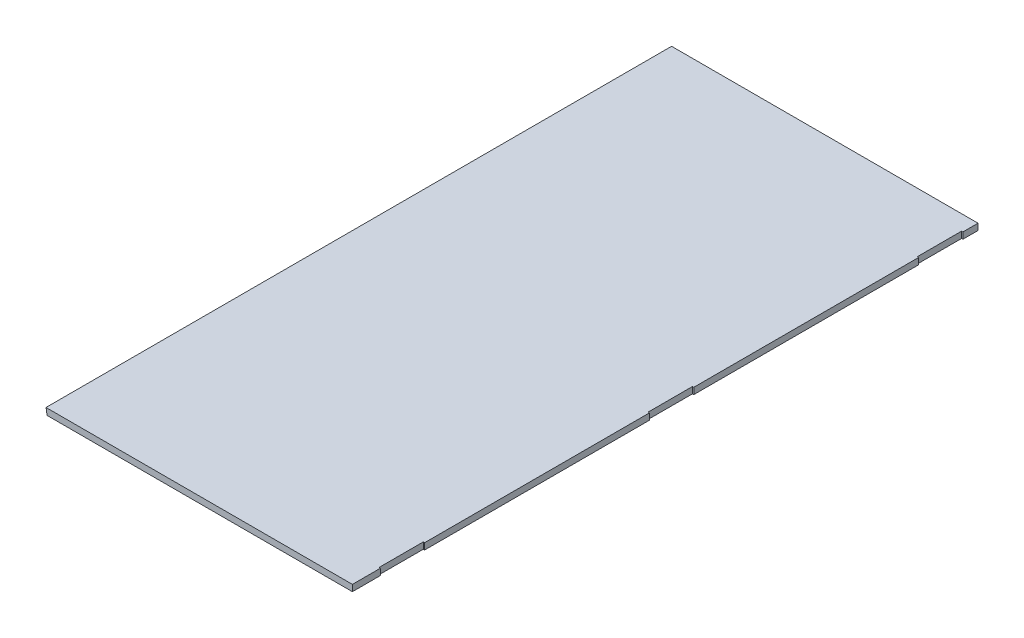
ISO-10303-21;
HEADER;
FILE_DESCRIPTION(('STEP AP214'),'2;1');
FILE_NAME('part.step','',(''),(''),'','','');
FILE_SCHEMA(('AUTOMOTIVE_DESIGN { 1 0 10303 214 1 1 1 1 }'));
ENDSEC;
DATA;
#1=APPLICATION_CONTEXT('core data for automotive mechanical design processes');
#2=APPLICATION_PROTOCOL_DEFINITION('international standard','automotive_design',2000,#1);
#3=PRODUCT_CONTEXT('',#1,'mechanical');
#4=PRODUCT('Part','Part','',(#3));
#5=PRODUCT_RELATED_PRODUCT_CATEGORY('part','',(#4));
#6=PRODUCT_DEFINITION_FORMATION('','',#4);
#7=PRODUCT_DEFINITION_CONTEXT('part definition',#1,'design');
#8=PRODUCT_DEFINITION('design','',#6,#7);
#9=PRODUCT_DEFINITION_SHAPE('','',#8);
#10=(LENGTH_UNIT() NAMED_UNIT(*) SI_UNIT(.MILLI.,.METRE.));
#11=(NAMED_UNIT(*) PLANE_ANGLE_UNIT() SI_UNIT($,.RADIAN.));
#12=(NAMED_UNIT(*) SI_UNIT($,.STERADIAN.) SOLID_ANGLE_UNIT());
#13=UNCERTAINTY_MEASURE_WITH_UNIT(LENGTH_MEASURE(1.E-05),#10,'distance_accuracy_value','');
#14=(GEOMETRIC_REPRESENTATION_CONTEXT(3) GLOBAL_UNCERTAINTY_ASSIGNED_CONTEXT((#13)) GLOBAL_UNIT_ASSIGNED_CONTEXT((#10,
#11,#12)) REPRESENTATION_CONTEXT('',''));
#15=CARTESIAN_POINT('',(0.,0.,0.));
#16=DIRECTION('',(0.,0.,1.));
#17=DIRECTION('',(1.,0.,0.));
#18=AXIS2_PLACEMENT_3D('',#15,#16,#17);
#19=CARTESIAN_POINT('',(438.912,18.25625,896.112));
#20=DIRECTION('',(-1.,0.,0.));
#21=DIRECTION('',(0.,0.,1.));
#22=AXIS2_PLACEMENT_3D('',#19,#20,#21);
#23=PLANE('',#22);
#24=DIRECTION('',(0.,0.,-1.));
#25=VECTOR('',#24,1.);
#26=CARTESIAN_POINT('',(438.912,18.25625,896.112));
#27=LINE('',#26,#25);
#28=CARTESIAN_POINT('',(438.912,18.25625,689.356));
#29=VERTEX_POINT('',#28);
#30=CARTESIAN_POINT('',(438.912,18.25625,45.212));
#31=VERTEX_POINT('',#30);
#32=EDGE_CURVE('E256',#29,#31,#27,.T.);
#33=ORIENTED_EDGE('',*,*,#32,.F.);
#34=DIRECTION('',(0.,1.,0.));
#35=VECTOR('',#34,1.);
#36=CARTESIAN_POINT('',(438.912,0.,689.356));
#37=LINE('',#36,#35);
#38=CARTESIAN_POINT('',(438.912,0.,689.356));
#39=VERTEX_POINT('',#38);
#40=EDGE_CURVE('E210',#39,#29,#37,.T.);
#41=ORIENTED_EDGE('',*,*,#40,.F.);
#42=DIRECTION('',(0.,0.,-1.));
#43=VECTOR('',#42,1.);
#44=CARTESIAN_POINT('',(438.912,0.,896.112));
#45=LINE('',#44,#43);
#46=CARTESIAN_POINT('',(438.912,0.,45.212));
#47=VERTEX_POINT('',#46);
#48=EDGE_CURVE('E195',#39,#47,#45,.T.);
#49=ORIENTED_EDGE('',*,*,#48,.T.);
#50=DIRECTION('',(0.,-1.,0.));
#51=VECTOR('',#50,1.);
#52=CARTESIAN_POINT('',(438.912,18.25625,45.212));
#53=LINE('',#52,#51);
#54=EDGE_CURVE('E208',#31,#47,#53,.T.);
#55=ORIENTED_EDGE('',*,*,#54,.F.);
#56=EDGE_LOOP('',(#33,#41,#49,#55));
#57=FACE_BOUND('',#56,.T.);
#58=ADVANCED_FACE('F38',(#57),#23,.F.);
#59=CARTESIAN_POINT('',(438.912,0.,896.112));
#60=VERTEX_POINT('',#59);
#61=CARTESIAN_POINT('',(438.912,0.,816.356));
#62=VERTEX_POINT('',#61);
#63=EDGE_CURVE('E167',#60,#62,#45,.T.);
#64=ORIENTED_EDGE('',*,*,#63,.T.);
#65=DIRECTION('',(0.,-1.,0.));
#66=VECTOR('',#65,1.);
#67=CARTESIAN_POINT('',(438.912,18.25625,816.356));
#68=LINE('',#67,#66);
#69=CARTESIAN_POINT('',(438.912,18.25625,816.356));
#70=VERTEX_POINT('',#69);
#71=EDGE_CURVE('E265',#70,#62,#68,.T.);
#72=ORIENTED_EDGE('',*,*,#71,.F.);
#73=CARTESIAN_POINT('',(438.912,18.25625,896.112));
#74=VERTEX_POINT('',#73);
#75=EDGE_CURVE('E173',#74,#70,#27,.T.);
#76=ORIENTED_EDGE('',*,*,#75,.F.);
#77=DIRECTION('',(0.,-1.,0.));
#78=VECTOR('',#77,1.);
#79=CARTESIAN_POINT('',(438.912,18.25625,896.112));
#80=LINE('',#79,#78);
#81=EDGE_CURVE('E177',#74,#60,#80,.T.);
#82=ORIENTED_EDGE('',*,*,#81,.T.);
#83=EDGE_LOOP('',(#64,#72,#76,#82));
#84=FACE_BOUND('',#83,.T.);
#85=ADVANCED_FACE('F264',(#84),#23,.F.);
#86=CARTESIAN_POINT('',(438.912,18.2562499999998,-81.788));
#87=VERTEX_POINT('',#86);
#88=CARTESIAN_POINT('',(438.912,18.25625,-725.932));
#89=VERTEX_POINT('',#88);
#90=EDGE_CURVE('E171',#87,#89,#27,.T.);
#91=ORIENTED_EDGE('',*,*,#90,.F.);
#92=DIRECTION('',(0.,1.,0.));
#93=VECTOR('',#92,1.);
#94=CARTESIAN_POINT('',(438.912,0.,-81.788));
#95=LINE('',#94,#93);
#96=CARTESIAN_POINT('',(438.912,0.,-81.788));
#97=VERTEX_POINT('',#96);
#98=EDGE_CURVE('E283',#97,#87,#95,.T.);
#99=ORIENTED_EDGE('',*,*,#98,.F.);
#100=CARTESIAN_POINT('',(438.912,0.,-725.932));
#101=VERTEX_POINT('',#100);
#102=EDGE_CURVE('E192',#97,#101,#45,.T.);
#103=ORIENTED_EDGE('',*,*,#102,.T.);
#104=DIRECTION('',(0.,-1.,0.));
#105=VECTOR('',#104,1.);
#106=CARTESIAN_POINT('',(438.912,18.25625,-725.932));
#107=LINE('',#106,#105);
#108=EDGE_CURVE('E243',#89,#101,#107,.T.);
#109=ORIENTED_EDGE('',*,*,#108,.F.);
#110=EDGE_LOOP('',(#91,#99,#103,#109));
#111=FACE_BOUND('',#110,.T.);
#112=ADVANCED_FACE('F298',(#111),#23,.F.);
#113=CARTESIAN_POINT('',(438.912,18.25625,-852.932));
#114=VERTEX_POINT('',#113);
#115=CARTESIAN_POINT('',(438.912,18.25625,-896.112));
#116=VERTEX_POINT('',#115);
#117=EDGE_CURVE('E168',#114,#116,#27,.T.);
#118=ORIENTED_EDGE('',*,*,#117,.F.);
#119=DIRECTION('',(0.,1.,0.));
#120=VECTOR('',#119,1.);
#121=CARTESIAN_POINT('',(438.912,0.,-852.932));
#122=LINE('',#121,#120);
#123=CARTESIAN_POINT('',(438.912,0.,-852.932));
#124=VERTEX_POINT('',#123);
#125=EDGE_CURVE('E190',#124,#114,#122,.T.);
#126=ORIENTED_EDGE('',*,*,#125,.F.);
#127=CARTESIAN_POINT('',(438.912,0.,-896.112));
#128=VERTEX_POINT('',#127);
#129=EDGE_CURVE('E189',#124,#128,#45,.T.);
#130=ORIENTED_EDGE('',*,*,#129,.T.);
#131=DIRECTION('',(0.,-1.,0.));
#132=VECTOR('',#131,1.);
#133=CARTESIAN_POINT('',(438.912,18.25625,-896.112));
#134=LINE('',#133,#132);
#135=EDGE_CURVE('E46',#116,#128,#134,.T.);
#136=ORIENTED_EDGE('',*,*,#135,.F.);
#137=EDGE_LOOP('',(#118,#126,#130,#136));
#138=FACE_BOUND('',#137,.T.);
#139=ADVANCED_FACE('F40',(#138),#23,.F.);
#140=CARTESIAN_POINT('',(-438.912,18.25625,-896.112));
#141=DIRECTION('',(0.,0.,1.));
#142=DIRECTION('',(1.,0.,0.));
#143=AXIS2_PLACEMENT_3D('',#140,#141,#142);
#144=PLANE('',#143);
#145=DIRECTION('',(-1.,0.,0.));
#146=VECTOR('',#145,1.);
#147=CARTESIAN_POINT('',(-438.912,0.,-896.112));
#148=LINE('',#147,#146);
#149=CARTESIAN_POINT('',(-435.692930558441,0.,-896.112));
#150=VERTEX_POINT('',#149);
#151=EDGE_CURVE('E169',#128,#150,#148,.T.);
#152=ORIENTED_EDGE('',*,*,#151,.T.);
#153=DIRECTION('',(-0.173648177666931,0.984807753012208,0.));
#154=VECTOR('',#153,1.);
#155=CARTESIAN_POINT('',(-438.912,18.25625,-896.112));
#156=LINE('',#155,#154);
#157=CARTESIAN_POINT('',(-438.912,18.25625,-896.112));
#158=VERTEX_POINT('',#157);
#159=EDGE_CURVE('E52',#150,#158,#156,.T.);
#160=ORIENTED_EDGE('',*,*,#159,.T.);
#161=DIRECTION('',(-1.,0.,0.));
#162=VECTOR('',#161,1.);
#163=CARTESIAN_POINT('',(-438.912,18.25625,-896.112));
#164=LINE('',#163,#162);
#165=EDGE_CURVE('E184',#116,#158,#164,.T.);
#166=ORIENTED_EDGE('',*,*,#165,.F.);
#167=ORIENTED_EDGE('',*,*,#135,.T.);
#168=EDGE_LOOP('',(#152,#160,#166,#167));
#169=FACE_BOUND('',#168,.T.);
#170=ADVANCED_FACE('F182',(#169),#144,.F.);
#171=CARTESIAN_POINT('',(-438.912,18.25625,896.112));
#172=DIRECTION('',(0.,0.,-1.));
#173=DIRECTION('',(-1.,0.,0.));
#174=AXIS2_PLACEMENT_3D('',#171,#172,#173);
#175=PLANE('',#174);
#176=DIRECTION('',(1.,0.,0.));
#177=VECTOR('',#176,1.);
#178=CARTESIAN_POINT('',(-438.912,18.25625,896.112));
#179=LINE('',#178,#177);
#180=CARTESIAN_POINT('',(-438.912,18.25625,896.112));
#181=VERTEX_POINT('',#180);
#182=EDGE_CURVE('E161',#181,#74,#179,.T.);
#183=ORIENTED_EDGE('',*,*,#182,.F.);
#184=DIRECTION('',(-0.173648177666931,0.984807753012208,0.));
#185=VECTOR('',#184,1.);
#186=CARTESIAN_POINT('',(-438.912,18.25625,896.112));
#187=LINE('',#186,#185);
#188=CARTESIAN_POINT('',(-435.692930558441,0.,896.112));
#189=VERTEX_POINT('',#188);
#190=EDGE_CURVE('E149',#189,#181,#187,.T.);
#191=ORIENTED_EDGE('',*,*,#190,.F.);
#192=DIRECTION('',(1.,0.,0.));
#193=VECTOR('',#192,1.);
#194=CARTESIAN_POINT('',(-438.912,0.,896.112));
#195=LINE('',#194,#193);
#196=EDGE_CURVE('E159',#189,#60,#195,.T.);
#197=ORIENTED_EDGE('',*,*,#196,.T.);
#198=ORIENTED_EDGE('',*,*,#81,.F.);
#199=EDGE_LOOP('',(#183,#191,#197,#198));
#200=FACE_BOUND('',#199,.T.);
#201=ADVANCED_FACE('F157',(#200),#175,.F.);
#202=CARTESIAN_POINT('',(0.,18.25625,0.));
#203=DIRECTION('',(0.,-1.,0.));
#204=DIRECTION('',(0.,0.,-1.));
#205=AXIS2_PLACEMENT_3D('',#202,#203,#204);
#206=PLANE('',#205);
#207=DIRECTION('',(0.,0.,1.));
#208=VECTOR('',#207,1.);
#209=CARTESIAN_POINT('',(435.102,18.25625,689.356));
#210=LINE('',#209,#208);
#211=CARTESIAN_POINT('',(435.102,18.25625,689.356));
#212=VERTEX_POINT('',#211);
#213=CARTESIAN_POINT('',(435.102,18.25625,816.356));
#214=VERTEX_POINT('',#213);
#215=EDGE_CURVE('E269',#212,#214,#210,.T.);
#216=ORIENTED_EDGE('',*,*,#215,.F.);
#217=DIRECTION('',(1.,0.,0.));
#218=VECTOR('',#217,1.);
#219=CARTESIAN_POINT('',(435.102,18.25625,689.356));
#220=LINE('',#219,#218);
#221=EDGE_CURVE('E193',#212,#29,#220,.T.);
#222=ORIENTED_EDGE('',*,*,#221,.T.);
#223=ORIENTED_EDGE('',*,*,#32,.T.);
#224=DIRECTION('',(1.,0.,0.));
#225=VECTOR('',#224,1.);
#226=CARTESIAN_POINT('',(435.102,18.25625,45.212));
#227=LINE('',#226,#225);
#228=CARTESIAN_POINT('',(435.102,18.25625,45.212));
#229=VERTEX_POINT('',#228);
#230=EDGE_CURVE('E267',#229,#31,#227,.T.);
#231=ORIENTED_EDGE('',*,*,#230,.F.);
#232=DIRECTION('',(0.,0.,1.));
#233=VECTOR('',#232,1.);
#234=CARTESIAN_POINT('',(435.102,18.2562499999998,-81.788));
#235=LINE('',#234,#233);
#236=CARTESIAN_POINT('',(435.102,18.2562499999998,-81.788));
#237=VERTEX_POINT('',#236);
#238=EDGE_CURVE('E222',#237,#229,#235,.T.);
#239=ORIENTED_EDGE('',*,*,#238,.F.);
#240=DIRECTION('',(1.,0.,0.));
#241=VECTOR('',#240,1.);
#242=CARTESIAN_POINT('',(435.102,18.2562499999998,-81.788));
#243=LINE('',#242,#241);
#244=EDGE_CURVE('E224',#237,#87,#243,.T.);
#245=ORIENTED_EDGE('',*,*,#244,.T.);
#246=ORIENTED_EDGE('',*,*,#90,.T.);
#247=DIRECTION('',(1.,0.,0.));
#248=VECTOR('',#247,1.);
#249=CARTESIAN_POINT('',(435.102,18.25625,-725.932));
#250=LINE('',#249,#248);
#251=CARTESIAN_POINT('',(435.102,18.25625,-725.932));
#252=VERTEX_POINT('',#251);
#253=EDGE_CURVE('E246',#252,#89,#250,.T.);
#254=ORIENTED_EDGE('',*,*,#253,.F.);
#255=DIRECTION('',(0.,0.,1.));
#256=VECTOR('',#255,1.);
#257=CARTESIAN_POINT('',(435.102,18.25625,-852.932));
#258=LINE('',#257,#256);
#259=CARTESIAN_POINT('',(435.102,18.25625,-852.932));
#260=VERTEX_POINT('',#259);
#261=EDGE_CURVE('E239',#260,#252,#258,.T.);
#262=ORIENTED_EDGE('',*,*,#261,.F.);
#263=DIRECTION('',(1.,0.,0.));
#264=VECTOR('',#263,1.);
#265=CARTESIAN_POINT('',(435.102,18.25625,-852.932));
#266=LINE('',#265,#264);
#267=EDGE_CURVE('E248',#260,#114,#266,.T.);
#268=ORIENTED_EDGE('',*,*,#267,.T.);
#269=ORIENTED_EDGE('',*,*,#117,.T.);
#270=ORIENTED_EDGE('',*,*,#165,.T.);
#271=DIRECTION('',(0.,0.,1.));
#272=VECTOR('',#271,1.);
#273=CARTESIAN_POINT('',(-438.912,18.25625,896.112));
#274=LINE('',#273,#272);
#275=EDGE_CURVE('E258',#158,#181,#274,.T.);
#276=ORIENTED_EDGE('',*,*,#275,.T.);
#277=ORIENTED_EDGE('',*,*,#182,.T.);
#278=ORIENTED_EDGE('',*,*,#75,.T.);
#279=DIRECTION('',(1.,0.,0.));
#280=VECTOR('',#279,1.);
#281=CARTESIAN_POINT('',(435.102,18.25625,816.356));
#282=LINE('',#281,#280);
#283=EDGE_CURVE('E279',#214,#70,#282,.T.);
#284=ORIENTED_EDGE('',*,*,#283,.F.);
#285=EDGE_LOOP('',(#216,#222,#223,#231,#239,#245,#246,#254,#262,#268,#269,#270,#276,#277,#278,#284));
#286=FACE_BOUND('',#285,.T.);
#287=ADVANCED_FACE('F261',(#286),#206,.F.);
#288=CARTESIAN_POINT('',(0.,0.,0.));
#289=DIRECTION('',(0.,-1.,0.));
#290=DIRECTION('',(0.,0.,-1.));
#291=AXIS2_PLACEMENT_3D('',#288,#289,#290);
#292=PLANE('',#291);
#293=DIRECTION('',(0.,0.,1.));
#294=VECTOR('',#293,1.);
#295=CARTESIAN_POINT('',(-435.692930558441,0.,0.));
#296=LINE('',#295,#294);
#297=EDGE_CURVE('E11',#150,#189,#296,.T.);
#298=ORIENTED_EDGE('',*,*,#297,.F.);
#299=ORIENTED_EDGE('',*,*,#151,.F.);
#300=ORIENTED_EDGE('',*,*,#129,.F.);
#301=DIRECTION('',(1.,0.,0.));
#302=VECTOR('',#301,1.);
#303=CARTESIAN_POINT('',(435.102,0.,-852.932));
#304=LINE('',#303,#302);
#305=CARTESIAN_POINT('',(435.102,0.,-852.932));
#306=VERTEX_POINT('',#305);
#307=EDGE_CURVE('E251',#306,#124,#304,.T.);
#308=ORIENTED_EDGE('',*,*,#307,.F.);
#309=DIRECTION('',(0.,0.,-1.));
#310=VECTOR('',#309,1.);
#311=CARTESIAN_POINT('',(435.102,0.,-725.932));
#312=LINE('',#311,#310);
#313=CARTESIAN_POINT('',(435.102,0.,-725.932));
#314=VERTEX_POINT('',#313);
#315=EDGE_CURVE('E233',#314,#306,#312,.T.);
#316=ORIENTED_EDGE('',*,*,#315,.F.);
#317=DIRECTION('',(1.,0.,0.));
#318=VECTOR('',#317,1.);
#319=CARTESIAN_POINT('',(435.102,0.,-725.932));
#320=LINE('',#319,#318);
#321=EDGE_CURVE('E242',#314,#101,#320,.T.);
#322=ORIENTED_EDGE('',*,*,#321,.T.);
#323=ORIENTED_EDGE('',*,*,#102,.F.);
#324=DIRECTION('',(1.,0.,0.));
#325=VECTOR('',#324,1.);
#326=CARTESIAN_POINT('',(435.102,0.,-81.788));
#327=LINE('',#326,#325);
#328=CARTESIAN_POINT('',(435.102,0.,-81.788));
#329=VERTEX_POINT('',#328);
#330=EDGE_CURVE('E221',#329,#97,#327,.T.);
#331=ORIENTED_EDGE('',*,*,#330,.F.);
#332=DIRECTION('',(0.,0.,-1.));
#333=VECTOR('',#332,1.);
#334=CARTESIAN_POINT('',(435.102,0.,45.212));
#335=LINE('',#334,#333);
#336=CARTESIAN_POINT('',(435.102,0.,45.212));
#337=VERTEX_POINT('',#336);
#338=EDGE_CURVE('E219',#337,#329,#335,.T.);
#339=ORIENTED_EDGE('',*,*,#338,.F.);
#340=DIRECTION('',(1.,0.,0.));
#341=VECTOR('',#340,1.);
#342=CARTESIAN_POINT('',(435.102,0.,45.212));
#343=LINE('',#342,#341);
#344=EDGE_CURVE('E216',#337,#47,#343,.T.);
#345=ORIENTED_EDGE('',*,*,#344,.T.);
#346=ORIENTED_EDGE('',*,*,#48,.F.);
#347=DIRECTION('',(1.,0.,0.));
#348=VECTOR('',#347,1.);
#349=CARTESIAN_POINT('',(435.102,0.,689.356));
#350=LINE('',#349,#348);
#351=CARTESIAN_POINT('',(435.102,0.,689.356));
#352=VERTEX_POINT('',#351);
#353=EDGE_CURVE('E197',#352,#39,#350,.T.);
#354=ORIENTED_EDGE('',*,*,#353,.F.);
#355=DIRECTION('',(0.,0.,-1.));
#356=VECTOR('',#355,1.);
#357=CARTESIAN_POINT('',(435.102,0.,816.356));
#358=LINE('',#357,#356);
#359=CARTESIAN_POINT('',(435.102,0.,816.356));
#360=VERTEX_POINT('',#359);
#361=EDGE_CURVE('E305',#360,#352,#358,.T.);
#362=ORIENTED_EDGE('',*,*,#361,.F.);
#363=DIRECTION('',(1.,0.,0.));
#364=VECTOR('',#363,1.);
#365=CARTESIAN_POINT('',(435.102,0.,816.356));
#366=LINE('',#365,#364);
#367=EDGE_CURVE('E277',#360,#62,#366,.T.);
#368=ORIENTED_EDGE('',*,*,#367,.T.);
#369=ORIENTED_EDGE('',*,*,#63,.F.);
#370=ORIENTED_EDGE('',*,*,#196,.F.);
#371=EDGE_LOOP('',(#298,#299,#300,#308,#316,#322,#323,#331,#339,#345,#346,#354,#362,#368,#369,#370));
#372=FACE_BOUND('',#371,.T.);
#373=ADVANCED_FACE('F164',(#372),#292,.T.);
#374=CARTESIAN_POINT('',(435.102,18.25625,-725.932));
#375=DIRECTION('',(0.,0.,1.));
#376=DIRECTION('',(1.,0.,0.));
#377=AXIS2_PLACEMENT_3D('',#374,#375,#376);
#378=PLANE('',#377);
#379=ORIENTED_EDGE('',*,*,#108,.T.);
#380=ORIENTED_EDGE('',*,*,#321,.F.);
#381=DIRECTION('',(0.,-1.,0.));
#382=VECTOR('',#381,1.);
#383=CARTESIAN_POINT('',(435.102,18.25625,-725.932));
#384=LINE('',#383,#382);
#385=EDGE_CURVE('E231',#252,#314,#384,.T.);
#386=ORIENTED_EDGE('',*,*,#385,.F.);
#387=ORIENTED_EDGE('',*,*,#253,.T.);
#388=EDGE_LOOP('',(#379,#380,#386,#387));
#389=FACE_BOUND('',#388,.T.);
#390=ADVANCED_FACE('F317',(#389),#378,.F.);
#391=CARTESIAN_POINT('',(435.102,0.,-852.932));
#392=DIRECTION('',(0.,0.,-1.));
#393=DIRECTION('',(-1.,0.,0.));
#394=AXIS2_PLACEMENT_3D('',#391,#392,#393);
#395=PLANE('',#394);
#396=ORIENTED_EDGE('',*,*,#125,.T.);
#397=ORIENTED_EDGE('',*,*,#267,.F.);
#398=DIRECTION('',(0.,1.,0.));
#399=VECTOR('',#398,1.);
#400=CARTESIAN_POINT('',(435.102,0.,-852.932));
#401=LINE('',#400,#399);
#402=EDGE_CURVE('E236',#306,#260,#401,.T.);
#403=ORIENTED_EDGE('',*,*,#402,.F.);
#404=ORIENTED_EDGE('',*,*,#307,.T.);
#405=EDGE_LOOP('',(#396,#397,#403,#404));
#406=FACE_BOUND('',#405,.T.);
#407=ADVANCED_FACE('F311',(#406),#395,.F.);
#408=CARTESIAN_POINT('',(435.102,0.,0.));
#409=DIRECTION('',(1.,0.,0.));
#410=DIRECTION('',(0.,0.,-1.));
#411=AXIS2_PLACEMENT_3D('',#408,#409,#410);
#412=PLANE('',#411);
#413=ORIENTED_EDGE('',*,*,#385,.T.);
#414=ORIENTED_EDGE('',*,*,#315,.T.);
#415=ORIENTED_EDGE('',*,*,#402,.T.);
#416=ORIENTED_EDGE('',*,*,#261,.T.);
#417=EDGE_LOOP('',(#413,#414,#415,#416));
#418=FACE_BOUND('',#417,.T.);
#419=ADVANCED_FACE('F313',(#418),#412,.T.);
#420=CARTESIAN_POINT('',(435.102,18.25625,45.212));
#421=DIRECTION('',(0.,0.,1.));
#422=DIRECTION('',(1.,0.,0.));
#423=AXIS2_PLACEMENT_3D('',#420,#421,#422);
#424=PLANE('',#423);
#425=ORIENTED_EDGE('',*,*,#54,.T.);
#426=ORIENTED_EDGE('',*,*,#344,.F.);
#427=DIRECTION('',(0.,-1.,0.));
#428=VECTOR('',#427,1.);
#429=CARTESIAN_POINT('',(435.102,18.25625,45.212));
#430=LINE('',#429,#428);
#431=EDGE_CURVE('E281',#229,#337,#430,.T.);
#432=ORIENTED_EDGE('',*,*,#431,.F.);
#433=ORIENTED_EDGE('',*,*,#230,.T.);
#434=EDGE_LOOP('',(#425,#426,#432,#433));
#435=FACE_BOUND('',#434,.T.);
#436=ADVANCED_FACE('F365',(#435),#424,.F.);
#437=CARTESIAN_POINT('',(435.102,0.,-81.788));
#438=DIRECTION('',(0.,0.,-1.));
#439=DIRECTION('',(-1.,0.,0.));
#440=AXIS2_PLACEMENT_3D('',#437,#438,#439);
#441=PLANE('',#440);
#442=ORIENTED_EDGE('',*,*,#98,.T.);
#443=ORIENTED_EDGE('',*,*,#244,.F.);
#444=DIRECTION('',(0.,1.,0.));
#445=VECTOR('',#444,1.);
#446=CARTESIAN_POINT('',(435.102,0.,-81.788));
#447=LINE('',#446,#445);
#448=EDGE_CURVE('E227',#329,#237,#447,.T.);
#449=ORIENTED_EDGE('',*,*,#448,.F.);
#450=ORIENTED_EDGE('',*,*,#330,.T.);
#451=EDGE_LOOP('',(#442,#443,#449,#450));
#452=FACE_BOUND('',#451,.T.);
#453=ADVANCED_FACE('F373',(#452),#441,.F.);
#454=CARTESIAN_POINT('',(435.102,0.,0.));
#455=DIRECTION('',(1.,0.,0.));
#456=DIRECTION('',(0.,0.,-1.));
#457=AXIS2_PLACEMENT_3D('',#454,#455,#456);
#458=PLANE('',#457);
#459=ORIENTED_EDGE('',*,*,#431,.T.);
#460=ORIENTED_EDGE('',*,*,#338,.T.);
#461=ORIENTED_EDGE('',*,*,#448,.T.);
#462=ORIENTED_EDGE('',*,*,#238,.T.);
#463=EDGE_LOOP('',(#459,#460,#461,#462));
#464=FACE_BOUND('',#463,.T.);
#465=ADVANCED_FACE('F381',(#464),#458,.T.);
#466=CARTESIAN_POINT('',(435.102,0.,689.356));
#467=DIRECTION('',(0.,0.,-1.));
#468=DIRECTION('',(-1.,0.,0.));
#469=AXIS2_PLACEMENT_3D('',#466,#467,#468);
#470=PLANE('',#469);
#471=ORIENTED_EDGE('',*,*,#40,.T.);
#472=ORIENTED_EDGE('',*,*,#221,.F.);
#473=DIRECTION('',(0.,1.,0.));
#474=VECTOR('',#473,1.);
#475=CARTESIAN_POINT('',(435.102,0.,689.356));
#476=LINE('',#475,#474);
#477=EDGE_CURVE('E273',#352,#212,#476,.T.);
#478=ORIENTED_EDGE('',*,*,#477,.F.);
#479=ORIENTED_EDGE('',*,*,#353,.T.);
#480=EDGE_LOOP('',(#471,#472,#478,#479));
#481=FACE_BOUND('',#480,.T.);
#482=ADVANCED_FACE('F303',(#481),#470,.F.);
#483=CARTESIAN_POINT('',(435.102,18.25625,816.356));
#484=DIRECTION('',(0.,0.,1.));
#485=DIRECTION('',(1.,0.,0.));
#486=AXIS2_PLACEMENT_3D('',#483,#484,#485);
#487=PLANE('',#486);
#488=ORIENTED_EDGE('',*,*,#71,.T.);
#489=ORIENTED_EDGE('',*,*,#367,.F.);
#490=DIRECTION('',(0.,-1.,0.));
#491=VECTOR('',#490,1.);
#492=CARTESIAN_POINT('',(435.102,18.25625,816.356));
#493=LINE('',#492,#491);
#494=EDGE_CURVE('E60',#214,#360,#493,.T.);
#495=ORIENTED_EDGE('',*,*,#494,.F.);
#496=ORIENTED_EDGE('',*,*,#283,.T.);
#497=EDGE_LOOP('',(#488,#489,#495,#496));
#498=FACE_BOUND('',#497,.T.);
#499=ADVANCED_FACE('F397',(#498),#487,.F.);
#500=CARTESIAN_POINT('',(435.102,0.,0.));
#501=DIRECTION('',(1.,0.,0.));
#502=DIRECTION('',(0.,0.,-1.));
#503=AXIS2_PLACEMENT_3D('',#500,#501,#502);
#504=PLANE('',#503);
#505=ORIENTED_EDGE('',*,*,#215,.T.);
#506=ORIENTED_EDGE('',*,*,#494,.T.);
#507=ORIENTED_EDGE('',*,*,#361,.T.);
#508=ORIENTED_EDGE('',*,*,#477,.T.);
#509=EDGE_LOOP('',(#505,#506,#507,#508));
#510=FACE_BOUND('',#509,.T.);
#511=ADVANCED_FACE('F304',(#510),#504,.T.);
#512=CARTESIAN_POINT('',(-438.912,18.25625,-6723.888));
#513=DIRECTION('',(0.984807753012208,0.173648177666931,0.));
#514=DIRECTION('',(-0.173648177666931,0.984807753012208,0.));
#515=AXIS2_PLACEMENT_3D('',#512,#513,#514);
#516=PLANE('',#515);
#517=ORIENTED_EDGE('',*,*,#297,.T.);
#518=ORIENTED_EDGE('',*,*,#190,.T.);
#519=ORIENTED_EDGE('',*,*,#275,.F.);
#520=ORIENTED_EDGE('',*,*,#159,.F.);
#521=EDGE_LOOP('',(#517,#518,#519,#520));
#522=FACE_BOUND('',#521,.T.);
#523=ADVANCED_FACE('F148',(#522),#516,.F.);
#524=CLOSED_SHELL('',(#58,#85,#112,#139,#170,#201,#287,#373,#390,#407,#419,#436,#453,#465,#482,
#499,#511,#523));
#525=MANIFOLD_SOLID_BREP('B2',#524);
#526=ADVANCED_BREP_SHAPE_REPRESENTATION('',(#18,#525),#14);
#527=SHAPE_DEFINITION_REPRESENTATION(#9,#526);
ENDSEC;
END-ISO-10303-21;
